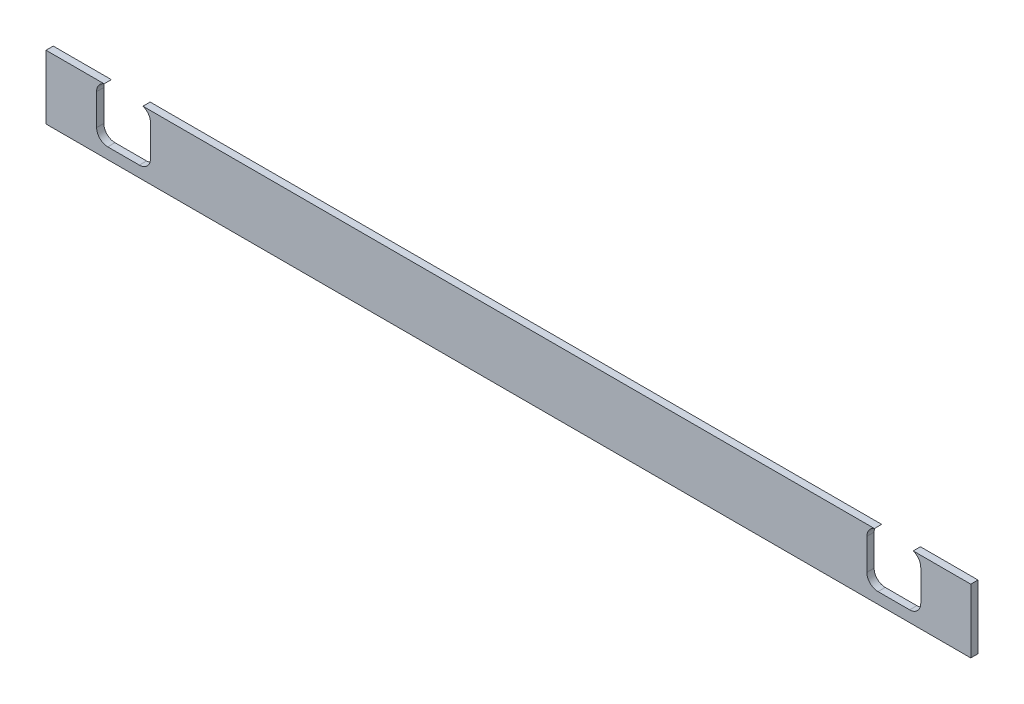
ISO-10303-21;
HEADER;
FILE_DESCRIPTION(('STEP AP214'),'2;1');
FILE_NAME('part.step','',(''),(''),'','','');
FILE_SCHEMA(('AUTOMOTIVE_DESIGN { 1 0 10303 214 1 1 1 1 }'));
ENDSEC;
DATA;
#1=APPLICATION_CONTEXT('core data for automotive mechanical design processes');
#2=APPLICATION_PROTOCOL_DEFINITION('international standard','automotive_design',2000,#1);
#3=PRODUCT_CONTEXT('',#1,'mechanical');
#4=PRODUCT('Part','Part','',(#3));
#5=PRODUCT_RELATED_PRODUCT_CATEGORY('part','',(#4));
#6=PRODUCT_DEFINITION_FORMATION('','',#4);
#7=PRODUCT_DEFINITION_CONTEXT('part definition',#1,'design');
#8=PRODUCT_DEFINITION('design','',#6,#7);
#9=PRODUCT_DEFINITION_SHAPE('','',#8);
#10=(LENGTH_UNIT() NAMED_UNIT(*) SI_UNIT(.MILLI.,.METRE.));
#11=(NAMED_UNIT(*) PLANE_ANGLE_UNIT() SI_UNIT($,.RADIAN.));
#12=(NAMED_UNIT(*) SI_UNIT($,.STERADIAN.) SOLID_ANGLE_UNIT());
#13=UNCERTAINTY_MEASURE_WITH_UNIT(LENGTH_MEASURE(1.E-05),#10,'distance_accuracy_value','');
#14=(GEOMETRIC_REPRESENTATION_CONTEXT(3) GLOBAL_UNCERTAINTY_ASSIGNED_CONTEXT((#13)) GLOBAL_UNIT_ASSIGNED_CONTEXT((#10,
#11,#12)) REPRESENTATION_CONTEXT('',''));
#15=CARTESIAN_POINT('',(0.,0.,0.));
#16=DIRECTION('',(0.,0.,1.));
#17=DIRECTION('',(1.,0.,0.));
#18=AXIS2_PLACEMENT_3D('',#15,#16,#17);
#19=CARTESIAN_POINT('',(-416.,28.75,6.5));
#20=DIRECTION('',(0.,-1.,0.));
#21=DIRECTION('',(0.,0.,-1.));
#22=AXIS2_PLACEMENT_3D('',#19,#20,#21);
#23=PLANE('',#22);
#24=DIRECTION('',(-1.,0.,0.));
#25=VECTOR('',#24,1.);
#26=CARTESIAN_POINT('',(-416.,28.75,0.));
#27=LINE('',#26,#25);
#28=CARTESIAN_POINT('',(329.329142598746,28.75,0.));
#29=VERTEX_POINT('',#28);
#30=CARTESIAN_POINT('',(-328.803119438364,28.75,0.));
#31=VERTEX_POINT('',#30);
#32=EDGE_CURVE('E310',#29,#31,#27,.T.);
#33=ORIENTED_EDGE('',*,*,#32,.T.);
#34=DIRECTION('',(0.,0.,-1.));
#35=VECTOR('',#34,1.);
#36=CARTESIAN_POINT('',(-328.803119438364,28.75,6.5));
#37=LINE('',#36,#35);
#38=CARTESIAN_POINT('',(-328.803119438364,28.75,6.5));
#39=VERTEX_POINT('',#38);
#40=EDGE_CURVE('E230',#31,#39,#37,.F.);
#41=ORIENTED_EDGE('',*,*,#40,.T.);
#42=DIRECTION('',(-1.,0.,0.));
#43=VECTOR('',#42,1.);
#44=CARTESIAN_POINT('',(-416.,28.75,6.5));
#45=LINE('',#44,#43);
#46=CARTESIAN_POINT('',(329.329142598746,28.75,6.5));
#47=VERTEX_POINT('',#46);
#48=EDGE_CURVE('E298',#47,#39,#45,.T.);
#49=ORIENTED_EDGE('',*,*,#48,.F.);
#50=DIRECTION('',(0.,0.,-1.));
#51=VECTOR('',#50,1.);
#52=CARTESIAN_POINT('',(329.329142598746,28.75,6.5));
#53=LINE('',#52,#51);
#54=EDGE_CURVE('E272',#47,#29,#53,.T.);
#55=ORIENTED_EDGE('',*,*,#54,.T.);
#56=EDGE_LOOP('',(#33,#41,#49,#55));
#57=FACE_BOUND('',#56,.T.);
#58=ADVANCED_FACE('F33',(#57),#23,.F.);
#59=CARTESIAN_POINT('',(416.,28.75,0.));
#60=VERTEX_POINT('',#59);
#61=CARTESIAN_POINT('',(364.196880561636,28.75,0.));
#62=VERTEX_POINT('',#61);
#63=EDGE_CURVE('E306',#60,#62,#27,.T.);
#64=ORIENTED_EDGE('',*,*,#63,.T.);
#65=DIRECTION('',(0.,0.,-1.));
#66=VECTOR('',#65,1.);
#67=CARTESIAN_POINT('',(364.196880561636,28.75,6.5));
#68=LINE('',#67,#66);
#69=CARTESIAN_POINT('',(364.196880561636,28.75,6.5));
#70=VERTEX_POINT('',#69);
#71=EDGE_CURVE('E285',#62,#70,#68,.F.);
#72=ORIENTED_EDGE('',*,*,#71,.T.);
#73=CARTESIAN_POINT('',(416.,28.75,6.5));
#74=VERTEX_POINT('',#73);
#75=EDGE_CURVE('E294',#74,#70,#45,.T.);
#76=ORIENTED_EDGE('',*,*,#75,.F.);
#77=DIRECTION('',(0.,0.,-1.));
#78=VECTOR('',#77,1.);
#79=CARTESIAN_POINT('',(416.,28.75,6.5));
#80=LINE('',#79,#78);
#81=EDGE_CURVE('E321',#74,#60,#80,.T.);
#82=ORIENTED_EDGE('',*,*,#81,.T.);
#83=EDGE_LOOP('',(#64,#72,#76,#82));
#84=FACE_BOUND('',#83,.T.);
#85=ADVANCED_FACE('F340',(#84),#23,.F.);
#86=CARTESIAN_POINT('',(416.,-28.75,6.5));
#87=DIRECTION('',(-1.,0.,0.));
#88=DIRECTION('',(0.,0.,1.));
#89=AXIS2_PLACEMENT_3D('',#86,#87,#88);
#90=PLANE('',#89);
#91=DIRECTION('',(0.,1.,0.));
#92=VECTOR('',#91,1.);
#93=CARTESIAN_POINT('',(416.,-28.75,0.));
#94=LINE('',#93,#92);
#95=CARTESIAN_POINT('',(416.,-28.75,0.));
#96=VERTEX_POINT('',#95);
#97=EDGE_CURVE('E288',#96,#60,#94,.T.);
#98=ORIENTED_EDGE('',*,*,#97,.T.);
#99=ORIENTED_EDGE('',*,*,#81,.F.);
#100=DIRECTION('',(0.,1.,0.));
#101=VECTOR('',#100,1.);
#102=CARTESIAN_POINT('',(416.,-28.75,6.5));
#103=LINE('',#102,#101);
#104=CARTESIAN_POINT('',(416.,-28.75,6.5));
#105=VERTEX_POINT('',#104);
#106=EDGE_CURVE('E289',#105,#74,#103,.T.);
#107=ORIENTED_EDGE('',*,*,#106,.F.);
#108=DIRECTION('',(0.,0.,-1.));
#109=VECTOR('',#108,1.);
#110=CARTESIAN_POINT('',(416.,-28.75,6.5));
#111=LINE('',#110,#109);
#112=EDGE_CURVE('E302',#105,#96,#111,.T.);
#113=ORIENTED_EDGE('',*,*,#112,.T.);
#114=EDGE_LOOP('',(#98,#99,#107,#113));
#115=FACE_BOUND('',#114,.T.);
#116=ADVANCED_FACE('F35',(#115),#90,.F.);
#117=CARTESIAN_POINT('',(-363.670857401254,28.75,6.5));
#118=VERTEX_POINT('',#117);
#119=CARTESIAN_POINT('',(-416.,28.75,6.5));
#120=VERTEX_POINT('',#119);
#121=EDGE_CURVE('E292',#118,#120,#45,.T.);
#122=ORIENTED_EDGE('',*,*,#121,.F.);
#123=DIRECTION('',(0.,0.,-1.));
#124=VECTOR('',#123,1.);
#125=CARTESIAN_POINT('',(-363.670857401254,28.75,6.5));
#126=LINE('',#125,#124);
#127=CARTESIAN_POINT('',(-363.670857401254,28.75,0.));
#128=VERTEX_POINT('',#127);
#129=EDGE_CURVE('E219',#118,#128,#126,.T.);
#130=ORIENTED_EDGE('',*,*,#129,.T.);
#131=CARTESIAN_POINT('',(-416.,28.75,0.));
#132=VERTEX_POINT('',#131);
#133=EDGE_CURVE('E305',#128,#132,#27,.T.);
#134=ORIENTED_EDGE('',*,*,#133,.T.);
#135=DIRECTION('',(0.,0.,-1.));
#136=VECTOR('',#135,1.);
#137=CARTESIAN_POINT('',(-416.,28.75,6.5));
#138=LINE('',#137,#136);
#139=EDGE_CURVE('E318',#120,#132,#138,.T.);
#140=ORIENTED_EDGE('',*,*,#139,.F.);
#141=EDGE_LOOP('',(#122,#130,#134,#140));
#142=FACE_BOUND('',#141,.T.);
#143=ADVANCED_FACE('F375',(#142),#23,.F.);
#144=CARTESIAN_POINT('',(-416.,-28.75,6.5));
#145=DIRECTION('',(1.,0.,0.));
#146=DIRECTION('',(0.,0.,-1.));
#147=AXIS2_PLACEMENT_3D('',#144,#145,#146);
#148=PLANE('',#147);
#149=DIRECTION('',(0.,-1.,0.));
#150=VECTOR('',#149,1.);
#151=CARTESIAN_POINT('',(-416.,-28.75,0.));
#152=LINE('',#151,#150);
#153=CARTESIAN_POINT('',(-416.,-28.75,0.));
#154=VERTEX_POINT('',#153);
#155=EDGE_CURVE('E309',#132,#154,#152,.T.);
#156=ORIENTED_EDGE('',*,*,#155,.T.);
#157=DIRECTION('',(0.,0.,-1.));
#158=VECTOR('',#157,1.);
#159=CARTESIAN_POINT('',(-416.,-28.75,6.5));
#160=LINE('',#159,#158);
#161=CARTESIAN_POINT('',(-416.,-28.75,6.5));
#162=VERTEX_POINT('',#161);
#163=EDGE_CURVE('E315',#162,#154,#160,.T.);
#164=ORIENTED_EDGE('',*,*,#163,.F.);
#165=DIRECTION('',(0.,-1.,0.));
#166=VECTOR('',#165,1.);
#167=CARTESIAN_POINT('',(-416.,-28.75,6.5));
#168=LINE('',#167,#166);
#169=EDGE_CURVE('E297',#120,#162,#168,.T.);
#170=ORIENTED_EDGE('',*,*,#169,.F.);
#171=ORIENTED_EDGE('',*,*,#139,.T.);
#172=EDGE_LOOP('',(#156,#164,#170,#171));
#173=FACE_BOUND('',#172,.T.);
#174=ADVANCED_FACE('F354',(#173),#148,.F.);
#175=CARTESIAN_POINT('',(-416.,-28.75,6.5));
#176=DIRECTION('',(0.,1.,0.));
#177=DIRECTION('',(0.,0.,1.));
#178=AXIS2_PLACEMENT_3D('',#175,#176,#177);
#179=PLANE('',#178);
#180=DIRECTION('',(1.,0.,0.));
#181=VECTOR('',#180,1.);
#182=CARTESIAN_POINT('',(-416.,-28.75,0.));
#183=LINE('',#182,#181);
#184=EDGE_CURVE('E293',#154,#96,#183,.T.);
#185=ORIENTED_EDGE('',*,*,#184,.T.);
#186=ORIENTED_EDGE('',*,*,#112,.F.);
#187=DIRECTION('',(1.,0.,0.));
#188=VECTOR('',#187,1.);
#189=CARTESIAN_POINT('',(-416.,-28.75,6.5));
#190=LINE('',#189,#188);
#191=EDGE_CURVE('E300',#162,#105,#190,.T.);
#192=ORIENTED_EDGE('',*,*,#191,.F.);
#193=ORIENTED_EDGE('',*,*,#163,.T.);
#194=EDGE_LOOP('',(#185,#186,#192,#193));
#195=FACE_BOUND('',#194,.T.);
#196=ADVANCED_FACE('F350',(#195),#179,.F.);
#197=CARTESIAN_POINT('',(0.,0.,6.5));
#198=DIRECTION('',(0.,0.,-1.));
#199=DIRECTION('',(-1.,0.,0.));
#200=AXIS2_PLACEMENT_3D('',#197,#198,#199);
#201=PLANE('',#200);
#202=ORIENTED_EDGE('',*,*,#48,.T.);
#203=CARTESIAN_POINT('',(-332.,19.2747715238821,6.5));
#204=DIRECTION('',(0.,0.,-1.));
#205=DIRECTION('',(1.,0.,0.));
#206=AXIS2_PLACEMENT_3D('',#203,#204,#205);
#207=CIRCLE('',#206,10.);
#208=CARTESIAN_POINT('',(-322.,19.2747715238821,6.5));
#209=VERTEX_POINT('',#208);
#210=EDGE_CURVE('E198',#39,#209,#207,.T.);
#211=ORIENTED_EDGE('',*,*,#210,.T.);
#212=DIRECTION('',(0.,-1.,0.));
#213=VECTOR('',#212,1.);
#214=CARTESIAN_POINT('',(-322.,-8.77135019670363,6.5));
#215=LINE('',#214,#213);
#216=CARTESIAN_POINT('',(-322.,-8.77135019670363,6.5));
#217=VERTEX_POINT('',#216);
#218=EDGE_CURVE('E201',#209,#217,#215,.T.);
#219=ORIENTED_EDGE('',*,*,#218,.T.);
#220=CARTESIAN_POINT('',(-332.,-8.77135019670362,6.5));
#221=DIRECTION('',(0.,0.,-1.));
#222=DIRECTION('',(1.,0.,0.));
#223=AXIS2_PLACEMENT_3D('',#220,#221,#222);
#224=CIRCLE('',#223,9.99999999999998);
#225=CARTESIAN_POINT('',(-332.,-18.7713501967036,6.5));
#226=VERTEX_POINT('',#225);
#227=EDGE_CURVE('E204',#217,#226,#224,.T.);
#228=ORIENTED_EDGE('',*,*,#227,.T.);
#229=DIRECTION('',(-1.,0.,0.));
#230=VECTOR('',#229,1.);
#231=CARTESIAN_POINT('',(-332.,-18.7713501967036,6.5));
#232=LINE('',#231,#230);
#233=CARTESIAN_POINT('',(-360.473976839619,-18.7713501967036,6.5));
#234=VERTEX_POINT('',#233);
#235=EDGE_CURVE('E177',#226,#234,#232,.T.);
#236=ORIENTED_EDGE('',*,*,#235,.T.);
#237=CARTESIAN_POINT('',(-360.473976839619,-8.77135019670362,6.5));
#238=DIRECTION('',(0.,0.,-1.));
#239=DIRECTION('',(1.,0.,0.));
#240=AXIS2_PLACEMENT_3D('',#237,#238,#239);
#241=CIRCLE('',#240,10.);
#242=CARTESIAN_POINT('',(-370.473976839619,-8.77135019670362,6.5));
#243=VERTEX_POINT('',#242);
#244=EDGE_CURVE('E171',#234,#243,#241,.T.);
#245=ORIENTED_EDGE('',*,*,#244,.T.);
#246=DIRECTION('',(0.,1.,0.));
#247=VECTOR('',#246,1.);
#248=CARTESIAN_POINT('',(-370.473976839619,-8.77135019670362,6.5));
#249=LINE('',#248,#247);
#250=CARTESIAN_POINT('',(-370.473976839619,19.2747715238821,6.5));
#251=VERTEX_POINT('',#250);
#252=EDGE_CURVE('E180',#243,#251,#249,.T.);
#253=ORIENTED_EDGE('',*,*,#252,.T.);
#254=CARTESIAN_POINT('',(-360.473976839619,19.2747715238821,6.5));
#255=DIRECTION('',(0.,0.,-1.));
#256=DIRECTION('',(-1.,0.,0.));
#257=AXIS2_PLACEMENT_3D('',#254,#255,#256);
#258=CIRCLE('',#257,10.);
#259=EDGE_CURVE('E185',#251,#118,#258,.T.);
#260=ORIENTED_EDGE('',*,*,#259,.T.);
#261=ORIENTED_EDGE('',*,*,#121,.T.);
#262=ORIENTED_EDGE('',*,*,#169,.T.);
#263=ORIENTED_EDGE('',*,*,#191,.T.);
#264=ORIENTED_EDGE('',*,*,#106,.T.);
#265=ORIENTED_EDGE('',*,*,#75,.T.);
#266=CARTESIAN_POINT('',(361.,19.2747715238821,6.5));
#267=DIRECTION('',(0.,0.,-1.));
#268=DIRECTION('',(1.,0.,0.));
#269=AXIS2_PLACEMENT_3D('',#266,#267,#268);
#270=CIRCLE('',#269,10.);
#271=CARTESIAN_POINT('',(371.,19.2747715238821,6.5));
#272=VERTEX_POINT('',#271);
#273=EDGE_CURVE('E243',#70,#272,#270,.T.);
#274=ORIENTED_EDGE('',*,*,#273,.T.);
#275=DIRECTION('',(0.,-1.,0.));
#276=VECTOR('',#275,1.);
#277=CARTESIAN_POINT('',(371.,-8.77135019670363,6.5));
#278=LINE('',#277,#276);
#279=CARTESIAN_POINT('',(371.,-8.77135019670363,6.5));
#280=VERTEX_POINT('',#279);
#281=EDGE_CURVE('E246',#272,#280,#278,.T.);
#282=ORIENTED_EDGE('',*,*,#281,.T.);
#283=CARTESIAN_POINT('',(361.,-8.77135019670362,6.5));
#284=DIRECTION('',(0.,0.,-1.));
#285=DIRECTION('',(1.,0.,0.));
#286=AXIS2_PLACEMENT_3D('',#283,#284,#285);
#287=CIRCLE('',#286,9.99999999999998);
#288=CARTESIAN_POINT('',(361.,-18.7713501967036,6.5));
#289=VERTEX_POINT('',#288);
#290=EDGE_CURVE('E249',#280,#289,#287,.T.);
#291=ORIENTED_EDGE('',*,*,#290,.T.);
#292=DIRECTION('',(-1.,0.,0.));
#293=VECTOR('',#292,1.);
#294=CARTESIAN_POINT('',(361.,-18.7713501967036,6.5));
#295=LINE('',#294,#293);
#296=CARTESIAN_POINT('',(332.526023160381,-18.7713501967036,6.5));
#297=VERTEX_POINT('',#296);
#298=EDGE_CURVE('E252',#289,#297,#295,.T.);
#299=ORIENTED_EDGE('',*,*,#298,.T.);
#300=CARTESIAN_POINT('',(332.526023160381,-8.77135019670362,6.5));
#301=DIRECTION('',(0.,0.,-1.));
#302=DIRECTION('',(1.,0.,0.));
#303=AXIS2_PLACEMENT_3D('',#300,#301,#302);
#304=CIRCLE('',#303,10.);
#305=CARTESIAN_POINT('',(322.526023160381,-8.77135019670362,6.5));
#306=VERTEX_POINT('',#305);
#307=EDGE_CURVE('E233',#297,#306,#304,.T.);
#308=ORIENTED_EDGE('',*,*,#307,.T.);
#309=DIRECTION('',(0.,1.,0.));
#310=VECTOR('',#309,1.);
#311=CARTESIAN_POINT('',(322.526023160381,-8.77135019670362,6.5));
#312=LINE('',#311,#310);
#313=CARTESIAN_POINT('',(322.526023160381,19.2747715238821,6.5));
#314=VERTEX_POINT('',#313);
#315=EDGE_CURVE('E236',#306,#314,#312,.T.);
#316=ORIENTED_EDGE('',*,*,#315,.T.);
#317=CARTESIAN_POINT('',(332.526023160381,19.2747715238821,6.5));
#318=DIRECTION('',(0.,0.,-1.));
#319=DIRECTION('',(-1.,0.,0.));
#320=AXIS2_PLACEMENT_3D('',#317,#318,#319);
#321=CIRCLE('',#320,10.);
#322=EDGE_CURVE('E240',#314,#47,#321,.T.);
#323=ORIENTED_EDGE('',*,*,#322,.T.);
#324=EDGE_LOOP('',(#202,#211,#219,#228,#236,#245,#253,#260,#261,#262,#263,#264,#265,#274,#282,
#291,#299,#308,#316,#323));
#325=FACE_BOUND('',#324,.T.);
#326=ADVANCED_FACE('F188',(#325),#201,.F.);
#327=CARTESIAN_POINT('',(0.,0.,0.));
#328=DIRECTION('',(0.,0.,-1.));
#329=DIRECTION('',(-1.,0.,0.));
#330=AXIS2_PLACEMENT_3D('',#327,#328,#329);
#331=PLANE('',#330);
#332=CARTESIAN_POINT('',(-332.,19.2747715238821,0.));
#333=DIRECTION('',(0.,0.,-1.));
#334=DIRECTION('',(-1.,0.,0.));
#335=AXIS2_PLACEMENT_3D('',#332,#333,#334);
#336=CIRCLE('',#335,10.);
#337=CARTESIAN_POINT('',(-322.,19.2747715238821,0.));
#338=VERTEX_POINT('',#337);
#339=EDGE_CURVE('E11',#31,#338,#336,.T.);
#340=ORIENTED_EDGE('',*,*,#339,.F.);
#341=ORIENTED_EDGE('',*,*,#32,.F.);
#342=CARTESIAN_POINT('',(332.526023160381,19.2747715238821,0.));
#343=DIRECTION('',(0.,0.,-1.));
#344=DIRECTION('',(-1.,0.,0.));
#345=AXIS2_PLACEMENT_3D('',#342,#343,#344);
#346=CIRCLE('',#345,10.);
#347=CARTESIAN_POINT('',(322.526023160381,19.2747715238821,0.));
#348=VERTEX_POINT('',#347);
#349=EDGE_CURVE('E260',#348,#29,#346,.T.);
#350=ORIENTED_EDGE('',*,*,#349,.F.);
#351=DIRECTION('',(0.,1.,0.));
#352=VECTOR('',#351,1.);
#353=CARTESIAN_POINT('',(322.526023160381,-8.77135019670362,0.));
#354=LINE('',#353,#352);
#355=CARTESIAN_POINT('',(322.526023160381,-8.77135019670362,0.));
#356=VERTEX_POINT('',#355);
#357=EDGE_CURVE('E257',#356,#348,#354,.T.);
#358=ORIENTED_EDGE('',*,*,#357,.F.);
#359=CARTESIAN_POINT('',(332.526023160381,-8.77135019670362,0.));
#360=DIRECTION('',(0.,0.,-1.));
#361=DIRECTION('',(1.,0.,0.));
#362=AXIS2_PLACEMENT_3D('',#359,#360,#361);
#363=CIRCLE('',#362,10.);
#364=CARTESIAN_POINT('',(332.526023160381,-18.7713501967036,0.));
#365=VERTEX_POINT('',#364);
#366=EDGE_CURVE('E56',#365,#356,#363,.T.);
#367=ORIENTED_EDGE('',*,*,#366,.F.);
#368=DIRECTION('',(-1.,0.,0.));
#369=VECTOR('',#368,1.);
#370=CARTESIAN_POINT('',(361.,-18.7713501967036,0.));
#371=LINE('',#370,#369);
#372=CARTESIAN_POINT('',(361.,-18.7713501967036,0.));
#373=VERTEX_POINT('',#372);
#374=EDGE_CURVE('E237',#373,#365,#371,.T.);
#375=ORIENTED_EDGE('',*,*,#374,.F.);
#376=CARTESIAN_POINT('',(361.,-8.77135019670362,0.));
#377=DIRECTION('',(0.,0.,-1.));
#378=DIRECTION('',(1.,0.,0.));
#379=AXIS2_PLACEMENT_3D('',#376,#377,#378);
#380=CIRCLE('',#379,9.99999999999998);
#381=CARTESIAN_POINT('',(371.,-8.77135019670363,0.));
#382=VERTEX_POINT('',#381);
#383=EDGE_CURVE('E265',#382,#373,#380,.T.);
#384=ORIENTED_EDGE('',*,*,#383,.F.);
#385=DIRECTION('',(0.,-1.,0.));
#386=VECTOR('',#385,1.);
#387=CARTESIAN_POINT('',(371.,-8.77135019670363,0.));
#388=LINE('',#387,#386);
#389=CARTESIAN_POINT('',(371.,19.2747715238821,0.));
#390=VERTEX_POINT('',#389);
#391=EDGE_CURVE('E262',#390,#382,#388,.T.);
#392=ORIENTED_EDGE('',*,*,#391,.F.);
#393=CARTESIAN_POINT('',(361.,19.2747715238821,0.));
#394=DIRECTION('',(0.,0.,-1.));
#395=DIRECTION('',(-1.,0.,0.));
#396=AXIS2_PLACEMENT_3D('',#393,#394,#395);
#397=CIRCLE('',#396,10.);
#398=EDGE_CURVE('E41',#62,#390,#397,.T.);
#399=ORIENTED_EDGE('',*,*,#398,.F.);
#400=ORIENTED_EDGE('',*,*,#63,.F.);
#401=ORIENTED_EDGE('',*,*,#97,.F.);
#402=ORIENTED_EDGE('',*,*,#184,.F.);
#403=ORIENTED_EDGE('',*,*,#155,.F.);
#404=ORIENTED_EDGE('',*,*,#133,.F.);
#405=CARTESIAN_POINT('',(-360.473976839619,19.2747715238821,0.));
#406=DIRECTION('',(0.,0.,-1.));
#407=DIRECTION('',(-1.,0.,0.));
#408=AXIS2_PLACEMENT_3D('',#405,#406,#407);
#409=CIRCLE('',#408,10.);
#410=CARTESIAN_POINT('',(-370.473976839619,19.2747715238821,0.));
#411=VERTEX_POINT('',#410);
#412=EDGE_CURVE('E210',#411,#128,#409,.T.);
#413=ORIENTED_EDGE('',*,*,#412,.F.);
#414=DIRECTION('',(0.,1.,0.));
#415=VECTOR('',#414,1.);
#416=CARTESIAN_POINT('',(-370.473976839619,-8.77135019670362,0.));
#417=LINE('',#416,#415);
#418=CARTESIAN_POINT('',(-370.473976839619,-8.77135019670362,0.));
#419=VERTEX_POINT('',#418);
#420=EDGE_CURVE('E208',#419,#411,#417,.T.);
#421=ORIENTED_EDGE('',*,*,#420,.F.);
#422=CARTESIAN_POINT('',(-360.473976839619,-8.77135019670362,0.));
#423=DIRECTION('',(0.,0.,-1.));
#424=DIRECTION('',(1.,0.,0.));
#425=AXIS2_PLACEMENT_3D('',#422,#423,#424);
#426=CIRCLE('',#425,10.);
#427=CARTESIAN_POINT('',(-360.473976839619,-18.7713501967036,0.));
#428=VERTEX_POINT('',#427);
#429=EDGE_CURVE('E48',#428,#419,#426,.T.);
#430=ORIENTED_EDGE('',*,*,#429,.F.);
#431=DIRECTION('',(-1.,0.,0.));
#432=VECTOR('',#431,1.);
#433=CARTESIAN_POINT('',(-332.,-18.7713501967036,0.));
#434=LINE('',#433,#432);
#435=CARTESIAN_POINT('',(-332.,-18.7713501967036,0.));
#436=VERTEX_POINT('',#435);
#437=EDGE_CURVE('E191',#436,#428,#434,.T.);
#438=ORIENTED_EDGE('',*,*,#437,.F.);
#439=CARTESIAN_POINT('',(-332.,-8.77135019670362,0.));
#440=DIRECTION('',(0.,0.,-1.));
#441=DIRECTION('',(1.,0.,0.));
#442=AXIS2_PLACEMENT_3D('',#439,#440,#441);
#443=CIRCLE('',#442,9.99999999999998);
#444=CARTESIAN_POINT('',(-322.,-8.77135019670363,0.));
#445=VERTEX_POINT('',#444);
#446=EDGE_CURVE('E194',#445,#436,#443,.T.);
#447=ORIENTED_EDGE('',*,*,#446,.F.);
#448=DIRECTION('',(0.,-1.,0.));
#449=VECTOR('',#448,1.);
#450=CARTESIAN_POINT('',(-322.,-8.77135019670363,0.));
#451=LINE('',#450,#449);
#452=EDGE_CURVE('E212',#338,#445,#451,.T.);
#453=ORIENTED_EDGE('',*,*,#452,.F.);
#454=EDGE_LOOP('',(#340,#341,#350,#358,#367,#375,#384,#392,#399,#400,#401,#402,#403,#404,#413,
#421,#430,#438,#447,#453));
#455=FACE_BOUND('',#454,.T.);
#456=ADVANCED_FACE('F333',(#455),#331,.T.);
#457=CARTESIAN_POINT('',(361.,19.2747715238821,6.5));
#458=DIRECTION('',(0.,0.,-1.));
#459=DIRECTION('',(-1.,0.,0.));
#460=AXIS2_PLACEMENT_3D('',#457,#458,#459);
#461=CYLINDRICAL_SURFACE('',#460,10.);
#462=ORIENTED_EDGE('',*,*,#398,.T.);
#463=DIRECTION('',(0.,0.,-1.));
#464=VECTOR('',#463,1.);
#465=CARTESIAN_POINT('',(371.,19.2747715238821,6.5));
#466=LINE('',#465,#464);
#467=EDGE_CURVE('E277',#272,#390,#466,.T.);
#468=ORIENTED_EDGE('',*,*,#467,.F.);
#469=ORIENTED_EDGE('',*,*,#273,.F.);
#470=ORIENTED_EDGE('',*,*,#71,.F.);
#471=EDGE_LOOP('',(#462,#468,#469,#470));
#472=FACE_BOUND('',#471,.T.);
#473=ADVANCED_FACE('F325',(#472),#461,.F.);
#474=CARTESIAN_POINT('',(332.526023160381,19.2747715238821,6.5));
#475=DIRECTION('',(0.,0.,-1.));
#476=DIRECTION('',(-1.,0.,0.));
#477=AXIS2_PLACEMENT_3D('',#474,#475,#476);
#478=CYLINDRICAL_SURFACE('',#477,10.);
#479=ORIENTED_EDGE('',*,*,#322,.F.);
#480=DIRECTION('',(0.,0.,-1.));
#481=VECTOR('',#480,1.);
#482=CARTESIAN_POINT('',(322.526023160381,19.2747715238821,6.5));
#483=LINE('',#482,#481);
#484=EDGE_CURVE('E280',#314,#348,#483,.T.);
#485=ORIENTED_EDGE('',*,*,#484,.T.);
#486=ORIENTED_EDGE('',*,*,#349,.T.);
#487=ORIENTED_EDGE('',*,*,#54,.F.);
#488=EDGE_LOOP('',(#479,#485,#486,#487));
#489=FACE_BOUND('',#488,.T.);
#490=ADVANCED_FACE('F428',(#489),#478,.F.);
#491=CARTESIAN_POINT('',(332.526023160381,-8.77135019670362,6.5));
#492=DIRECTION('',(0.,0.,-1.));
#493=DIRECTION('',(-1.,0.,0.));
#494=AXIS2_PLACEMENT_3D('',#491,#492,#493);
#495=CYLINDRICAL_SURFACE('',#494,10.);
#496=ORIENTED_EDGE('',*,*,#366,.T.);
#497=DIRECTION('',(0.,0.,-1.));
#498=VECTOR('',#497,1.);
#499=CARTESIAN_POINT('',(322.526023160381,-8.77135019670362,6.5));
#500=LINE('',#499,#498);
#501=EDGE_CURVE('E255',#306,#356,#500,.T.);
#502=ORIENTED_EDGE('',*,*,#501,.F.);
#503=ORIENTED_EDGE('',*,*,#307,.F.);
#504=DIRECTION('',(0.,0.,-1.));
#505=VECTOR('',#504,1.);
#506=CARTESIAN_POINT('',(332.526023160381,-18.7713501967036,6.5));
#507=LINE('',#506,#505);
#508=EDGE_CURVE('E270',#297,#365,#507,.T.);
#509=ORIENTED_EDGE('',*,*,#508,.T.);
#510=EDGE_LOOP('',(#496,#502,#503,#509));
#511=FACE_BOUND('',#510,.T.);
#512=ADVANCED_FACE('F435',(#511),#495,.F.);
#513=CARTESIAN_POINT('',(361.,-18.7713501967036,6.5));
#514=DIRECTION('',(0.,-1.,0.));
#515=DIRECTION('',(0.,0.,-1.));
#516=AXIS2_PLACEMENT_3D('',#513,#514,#515);
#517=PLANE('',#516);
#518=ORIENTED_EDGE('',*,*,#374,.T.);
#519=ORIENTED_EDGE('',*,*,#508,.F.);
#520=ORIENTED_EDGE('',*,*,#298,.F.);
#521=DIRECTION('',(0.,0.,-1.));
#522=VECTOR('',#521,1.);
#523=CARTESIAN_POINT('',(361.,-18.7713501967036,6.5));
#524=LINE('',#523,#522);
#525=EDGE_CURVE('E273',#289,#373,#524,.T.);
#526=ORIENTED_EDGE('',*,*,#525,.T.);
#527=EDGE_LOOP('',(#518,#519,#520,#526));
#528=FACE_BOUND('',#527,.T.);
#529=ADVANCED_FACE('F443',(#528),#517,.F.);
#530=CARTESIAN_POINT('',(361.,-8.77135019670362,6.5));
#531=DIRECTION('',(0.,0.,-1.));
#532=DIRECTION('',(-1.,0.,0.));
#533=AXIS2_PLACEMENT_3D('',#530,#531,#532);
#534=CYLINDRICAL_SURFACE('',#533,9.99999999999998);
#535=ORIENTED_EDGE('',*,*,#383,.T.);
#536=ORIENTED_EDGE('',*,*,#525,.F.);
#537=ORIENTED_EDGE('',*,*,#290,.F.);
#538=DIRECTION('',(0.,0.,-1.));
#539=VECTOR('',#538,1.);
#540=CARTESIAN_POINT('',(371.,-8.77135019670363,6.5));
#541=LINE('',#540,#539);
#542=EDGE_CURVE('E275',#280,#382,#541,.T.);
#543=ORIENTED_EDGE('',*,*,#542,.T.);
#544=EDGE_LOOP('',(#535,#536,#537,#543));
#545=FACE_BOUND('',#544,.T.);
#546=ADVANCED_FACE('F336',(#545),#534,.F.);
#547=CARTESIAN_POINT('',(371.,-8.77135019670363,6.5));
#548=DIRECTION('',(1.,0.,0.));
#549=DIRECTION('',(0.,0.,-1.));
#550=AXIS2_PLACEMENT_3D('',#547,#548,#549);
#551=PLANE('',#550);
#552=ORIENTED_EDGE('',*,*,#391,.T.);
#553=ORIENTED_EDGE('',*,*,#542,.F.);
#554=ORIENTED_EDGE('',*,*,#281,.F.);
#555=ORIENTED_EDGE('',*,*,#467,.T.);
#556=EDGE_LOOP('',(#552,#553,#554,#555));
#557=FACE_BOUND('',#556,.T.);
#558=ADVANCED_FACE('F330',(#557),#551,.F.);
#559=CARTESIAN_POINT('',(322.526023160381,-8.77135019670362,6.5));
#560=DIRECTION('',(-1.,0.,0.));
#561=DIRECTION('',(0.,0.,1.));
#562=AXIS2_PLACEMENT_3D('',#559,#560,#561);
#563=PLANE('',#562);
#564=ORIENTED_EDGE('',*,*,#357,.T.);
#565=ORIENTED_EDGE('',*,*,#484,.F.);
#566=ORIENTED_EDGE('',*,*,#315,.F.);
#567=ORIENTED_EDGE('',*,*,#501,.T.);
#568=EDGE_LOOP('',(#564,#565,#566,#567));
#569=FACE_BOUND('',#568,.T.);
#570=ADVANCED_FACE('F463',(#569),#563,.F.);
#571=CARTESIAN_POINT('',(-332.,19.2747715238821,6.5));
#572=DIRECTION('',(0.,0.,-1.));
#573=DIRECTION('',(-1.,0.,0.));
#574=AXIS2_PLACEMENT_3D('',#571,#572,#573);
#575=CYLINDRICAL_SURFACE('',#574,10.);
#576=ORIENTED_EDGE('',*,*,#339,.T.);
#577=DIRECTION('',(0.,0.,-1.));
#578=VECTOR('',#577,1.);
#579=CARTESIAN_POINT('',(-322.,19.2747715238821,6.5));
#580=LINE('',#579,#578);
#581=EDGE_CURVE('E224',#209,#338,#580,.T.);
#582=ORIENTED_EDGE('',*,*,#581,.F.);
#583=ORIENTED_EDGE('',*,*,#210,.F.);
#584=ORIENTED_EDGE('',*,*,#40,.F.);
#585=EDGE_LOOP('',(#576,#582,#583,#584));
#586=FACE_BOUND('',#585,.T.);
#587=ADVANCED_FACE('F368',(#586),#575,.F.);
#588=CARTESIAN_POINT('',(-360.473976839619,19.2747715238821,6.5));
#589=DIRECTION('',(0.,0.,-1.));
#590=DIRECTION('',(-1.,0.,0.));
#591=AXIS2_PLACEMENT_3D('',#588,#589,#590);
#592=CYLINDRICAL_SURFACE('',#591,10.);
#593=ORIENTED_EDGE('',*,*,#259,.F.);
#594=DIRECTION('',(0.,0.,-1.));
#595=VECTOR('',#594,1.);
#596=CARTESIAN_POINT('',(-370.473976839619,19.2747715238821,6.5));
#597=LINE('',#596,#595);
#598=EDGE_CURVE('E176',#251,#411,#597,.T.);
#599=ORIENTED_EDGE('',*,*,#598,.T.);
#600=ORIENTED_EDGE('',*,*,#412,.T.);
#601=ORIENTED_EDGE('',*,*,#129,.F.);
#602=EDGE_LOOP('',(#593,#599,#600,#601));
#603=FACE_BOUND('',#602,.T.);
#604=ADVANCED_FACE('F476',(#603),#592,.F.);
#605=CARTESIAN_POINT('',(-360.473976839619,-8.77135019670362,6.5));
#606=DIRECTION('',(0.,0.,-1.));
#607=DIRECTION('',(-1.,0.,0.));
#608=AXIS2_PLACEMENT_3D('',#605,#606,#607);
#609=CYLINDRICAL_SURFACE('',#608,10.);
#610=ORIENTED_EDGE('',*,*,#429,.T.);
#611=DIRECTION('',(0.,0.,-1.));
#612=VECTOR('',#611,1.);
#613=CARTESIAN_POINT('',(-370.473976839619,-8.77135019670362,6.5));
#614=LINE('',#613,#612);
#615=EDGE_CURVE('E167',#243,#419,#614,.T.);
#616=ORIENTED_EDGE('',*,*,#615,.F.);
#617=ORIENTED_EDGE('',*,*,#244,.F.);
#618=DIRECTION('',(0.,0.,-1.));
#619=VECTOR('',#618,1.);
#620=CARTESIAN_POINT('',(-360.473976839619,-18.7713501967036,6.5));
#621=LINE('',#620,#619);
#622=EDGE_CURVE('E217',#234,#428,#621,.T.);
#623=ORIENTED_EDGE('',*,*,#622,.T.);
#624=EDGE_LOOP('',(#610,#616,#617,#623));
#625=FACE_BOUND('',#624,.T.);
#626=ADVANCED_FACE('F169',(#625),#609,.F.);
#627=CARTESIAN_POINT('',(-332.,-18.7713501967036,6.5));
#628=DIRECTION('',(0.,-1.,0.));
#629=DIRECTION('',(0.,0.,-1.));
#630=AXIS2_PLACEMENT_3D('',#627,#628,#629);
#631=PLANE('',#630);
#632=ORIENTED_EDGE('',*,*,#437,.T.);
#633=ORIENTED_EDGE('',*,*,#622,.F.);
#634=ORIENTED_EDGE('',*,*,#235,.F.);
#635=DIRECTION('',(0.,0.,-1.));
#636=VECTOR('',#635,1.);
#637=CARTESIAN_POINT('',(-332.,-18.7713501967036,6.5));
#638=LINE('',#637,#636);
#639=EDGE_CURVE('E220',#226,#436,#638,.T.);
#640=ORIENTED_EDGE('',*,*,#639,.T.);
#641=EDGE_LOOP('',(#632,#633,#634,#640));
#642=FACE_BOUND('',#641,.T.);
#643=ADVANCED_FACE('F490',(#642),#631,.F.);
#644=CARTESIAN_POINT('',(-332.,-8.77135019670362,6.5));
#645=DIRECTION('',(0.,0.,-1.));
#646=DIRECTION('',(-1.,0.,0.));
#647=AXIS2_PLACEMENT_3D('',#644,#645,#646);
#648=CYLINDRICAL_SURFACE('',#647,9.99999999999998);
#649=ORIENTED_EDGE('',*,*,#446,.T.);
#650=ORIENTED_EDGE('',*,*,#639,.F.);
#651=ORIENTED_EDGE('',*,*,#227,.F.);
#652=DIRECTION('',(0.,0.,-1.));
#653=VECTOR('',#652,1.);
#654=CARTESIAN_POINT('',(-322.,-8.77135019670363,6.5));
#655=LINE('',#654,#653);
#656=EDGE_CURVE('E222',#217,#445,#655,.T.);
#657=ORIENTED_EDGE('',*,*,#656,.T.);
#658=EDGE_LOOP('',(#649,#650,#651,#657));
#659=FACE_BOUND('',#658,.T.);
#660=ADVANCED_FACE('F497',(#659),#648,.F.);
#661=CARTESIAN_POINT('',(-322.,-8.77135019670363,6.5));
#662=DIRECTION('',(1.,0.,0.));
#663=DIRECTION('',(0.,0.,-1.));
#664=AXIS2_PLACEMENT_3D('',#661,#662,#663);
#665=PLANE('',#664);
#666=ORIENTED_EDGE('',*,*,#452,.T.);
#667=ORIENTED_EDGE('',*,*,#656,.F.);
#668=ORIENTED_EDGE('',*,*,#218,.F.);
#669=ORIENTED_EDGE('',*,*,#581,.T.);
#670=EDGE_LOOP('',(#666,#667,#668,#669));
#671=FACE_BOUND('',#670,.T.);
#672=ADVANCED_FACE('F371',(#671),#665,.F.);
#673=CARTESIAN_POINT('',(-370.473976839619,-8.77135019670362,6.5));
#674=DIRECTION('',(-1.,0.,0.));
#675=DIRECTION('',(0.,0.,1.));
#676=AXIS2_PLACEMENT_3D('',#673,#674,#675);
#677=PLANE('',#676);
#678=ORIENTED_EDGE('',*,*,#420,.T.);
#679=ORIENTED_EDGE('',*,*,#598,.F.);
#680=ORIENTED_EDGE('',*,*,#252,.F.);
#681=ORIENTED_EDGE('',*,*,#615,.T.);
#682=EDGE_LOOP('',(#678,#679,#680,#681));
#683=FACE_BOUND('',#682,.T.);
#684=ADVANCED_FACE('F181',(#683),#677,.F.);
#685=CLOSED_SHELL('',(#58,#85,#116,#143,#174,#196,#326,#456,#473,#490,#512,#529,#546,#558,#570,
#587,#604,#626,#643,#660,#672,#684));
#686=MANIFOLD_SOLID_BREP('B2',#685);
#687=ADVANCED_BREP_SHAPE_REPRESENTATION('',(#18,#686),#14);
#688=SHAPE_DEFINITION_REPRESENTATION(#9,#687);
ENDSEC;
END-ISO-10303-21;
